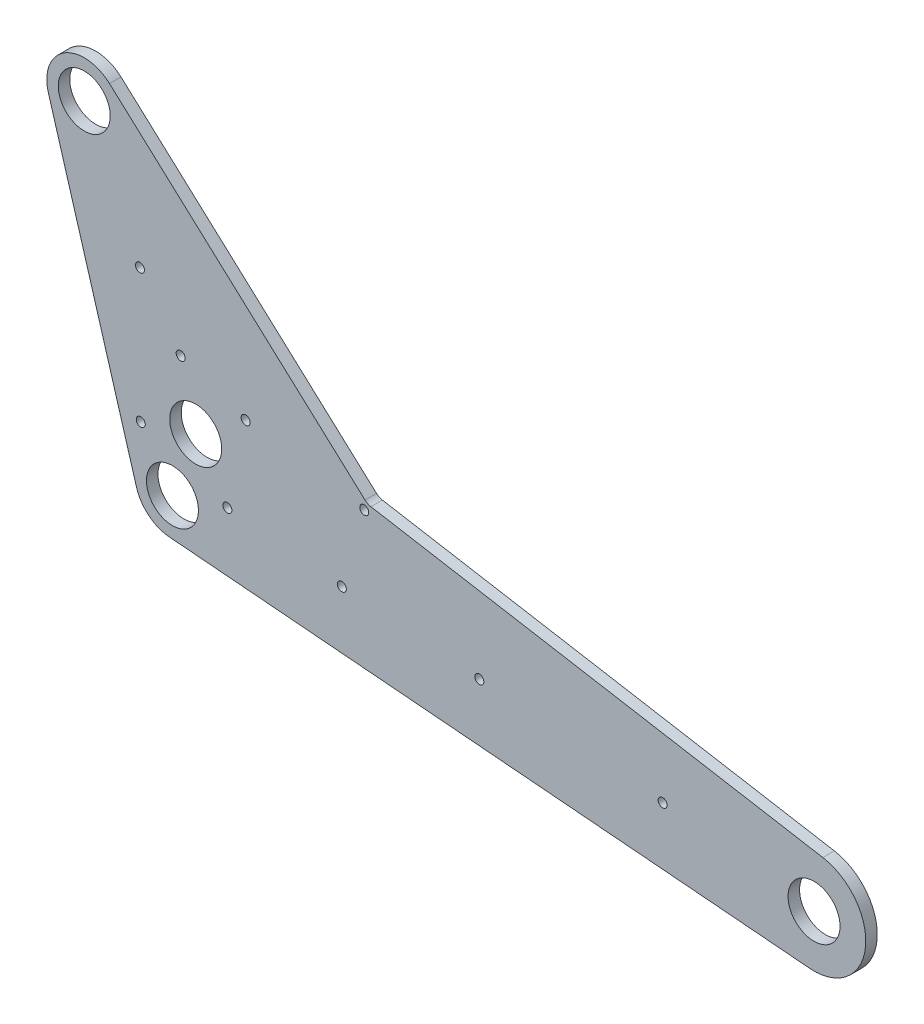
ISO-10303-21;
HEADER;
FILE_DESCRIPTION(('STEP AP214'),'2;1');
FILE_NAME('part.step','',(''),(''),'','','');
FILE_SCHEMA(('AUTOMOTIVE_DESIGN { 1 0 10303 214 1 1 1 1 }'));
ENDSEC;
DATA;
#1=APPLICATION_CONTEXT('core data for automotive mechanical design processes');
#2=APPLICATION_PROTOCOL_DEFINITION('international standard','automotive_design',2000,#1);
#3=PRODUCT_CONTEXT('',#1,'mechanical');
#4=PRODUCT('Part','Part','',(#3));
#5=PRODUCT_RELATED_PRODUCT_CATEGORY('part','',(#4));
#6=PRODUCT_DEFINITION_FORMATION('','',#4);
#7=PRODUCT_DEFINITION_CONTEXT('part definition',#1,'design');
#8=PRODUCT_DEFINITION('design','',#6,#7);
#9=PRODUCT_DEFINITION_SHAPE('','',#8);
#10=(LENGTH_UNIT() NAMED_UNIT(*) SI_UNIT(.MILLI.,.METRE.));
#11=(NAMED_UNIT(*) PLANE_ANGLE_UNIT() SI_UNIT($,.RADIAN.));
#12=(NAMED_UNIT(*) SI_UNIT($,.STERADIAN.) SOLID_ANGLE_UNIT());
#13=UNCERTAINTY_MEASURE_WITH_UNIT(LENGTH_MEASURE(1.E-05),#10,'distance_accuracy_value','');
#14=(GEOMETRIC_REPRESENTATION_CONTEXT(3) GLOBAL_UNCERTAINTY_ASSIGNED_CONTEXT((#13)) GLOBAL_UNIT_ASSIGNED_CONTEXT((#10,
#11,#12)) REPRESENTATION_CONTEXT('',''));
#15=CARTESIAN_POINT('',(0.,0.,0.));
#16=DIRECTION('',(0.,0.,1.));
#17=DIRECTION('',(1.,0.,0.));
#18=AXIS2_PLACEMENT_3D('',#15,#16,#17);
#19=CARTESIAN_POINT('',(0.,0.,3.175));
#20=DIRECTION('',(0.,0.,1.));
#21=DIRECTION('',(1.,0.,0.));
#22=AXIS2_PLACEMENT_3D('',#19,#20,#21);
#23=PLANE('',#22);
#24=CARTESIAN_POINT('',(-372.26106716212,121.779539966283,3.175));
#25=DIRECTION('',(0.,0.,1.));
#26=DIRECTION('',(1.,0.,0.));
#27=AXIS2_PLACEMENT_3D('',#24,#25,#26);
#28=CIRCLE('',#27,2.48920000000001);
#29=CARTESIAN_POINT('',(-369.77186716212,121.779539966283,3.175));
#30=VERTEX_POINT('',#29);
#31=EDGE_CURVE('E227',#30,#30,#28,.T.);
#32=ORIENTED_EDGE('',*,*,#31,.F.);
#33=EDGE_LOOP('',(#32));
#34=FACE_BOUND('',#33,.T.);
#35=CARTESIAN_POINT('',(-83.6094294253475,10.1591935134989,3.175));
#36=DIRECTION('',(0.,0.,1.));
#37=DIRECTION('',(1.,0.,0.));
#38=AXIS2_PLACEMENT_3D('',#35,#36,#37);
#39=CIRCLE('',#38,2.4892);
#40=CARTESIAN_POINT('',(-81.1202294253475,10.1591935134989,3.175));
#41=VERTEX_POINT('',#40);
#42=EDGE_CURVE('E231',#41,#41,#39,.T.);
#43=ORIENTED_EDGE('',*,*,#42,.F.);
#44=EDGE_LOOP('',(#43));
#45=FACE_BOUND('',#44,.T.);
#46=CARTESIAN_POINT('',(-260.794262036313,24.9367133535894,3.175));
#47=DIRECTION('',(0.,0.,1.));
#48=DIRECTION('',(1.,0.,0.));
#49=AXIS2_PLACEMENT_3D('',#46,#47,#48);
#50=CIRCLE('',#49,2.48920000000001);
#51=CARTESIAN_POINT('',(-258.305062036313,24.9367133535894,3.175));
#52=VERTEX_POINT('',#51);
#53=EDGE_CURVE('E224',#52,#52,#50,.T.);
#54=ORIENTED_EDGE('',*,*,#53,.F.);
#55=EDGE_LOOP('',(#54));
#56=FACE_BOUND('',#55,.T.);
#57=CARTESIAN_POINT('',(-184.857905203042,18.6034905649792,3.175));
#58=DIRECTION('',(0.,0.,1.));
#59=DIRECTION('',(1.,0.,0.));
#60=AXIS2_PLACEMENT_3D('',#57,#58,#59);
#61=CIRCLE('',#60,2.4892);
#62=CARTESIAN_POINT('',(-182.368705203042,18.6034905649792,3.175));
#63=VERTEX_POINT('',#62);
#64=EDGE_CURVE('E223',#63,#63,#61,.T.);
#65=ORIENTED_EDGE('',*,*,#64,.F.);
#66=EDGE_LOOP('',(#65));
#67=FACE_BOUND('',#66,.T.);
#68=CARTESIAN_POINT('',(-313.915715632056,77.9926583420795,3.175));
#69=DIRECTION('',(0.,0.,1.));
#70=DIRECTION('',(1.,0.,0.));
#71=AXIS2_PLACEMENT_3D('',#68,#69,#70);
#72=CIRCLE('',#71,2.48920000000001);
#73=CARTESIAN_POINT('',(-311.426515632056,77.9926583420795,3.175));
#74=VERTEX_POINT('',#73);
#75=EDGE_CURVE('E199',#74,#74,#72,.T.);
#76=ORIENTED_EDGE('',*,*,#75,.F.);
#77=EDGE_LOOP('',(#76));
#78=FACE_BOUND('',#77,.T.);
#79=CARTESIAN_POINT('',(-349.782746383436,90.8443549257835,3.175));
#80=DIRECTION('',(0.,0.,1.));
#81=DIRECTION('',(1.,0.,0.));
#82=AXIS2_PLACEMENT_3D('',#79,#80,#81);
#83=CIRCLE('',#82,2.48920000000001);
#84=CARTESIAN_POINT('',(-347.293546383436,90.8443549257835,3.175));
#85=VERTEX_POINT('',#84);
#86=EDGE_CURVE('E206',#85,#85,#83,.T.);
#87=ORIENTED_EDGE('',*,*,#86,.F.);
#88=EDGE_LOOP('',(#87));
#89=FACE_BOUND('',#88,.T.);
#90=CARTESIAN_POINT('',(-371.825205571629,48.1525159171764,3.175));
#91=DIRECTION('',(0.,0.,1.));
#92=DIRECTION('',(1.,0.,0.));
#93=AXIS2_PLACEMENT_3D('',#90,#91,#92);
#94=CIRCLE('',#93,2.48919999999983);
#95=CARTESIAN_POINT('',(-369.336005571629,48.1525159171764,3.175));
#96=VERTEX_POINT('',#95);
#97=EDGE_CURVE('E212',#96,#96,#94,.T.);
#98=ORIENTED_EDGE('',*,*,#97,.F.);
#99=EDGE_LOOP('',(#98));
#100=FACE_BOUND('',#99,.T.);
#101=CARTESIAN_POINT('',(-324.002497903123,31.0169204722377,3.175));
#102=DIRECTION('',(0.,0.,1.));
#103=DIRECTION('',(1.,0.,0.));
#104=AXIS2_PLACEMENT_3D('',#101,#102,#103);
#105=CIRCLE('',#104,2.48920000000001);
#106=CARTESIAN_POINT('',(-321.513297903123,31.0169204722377,3.175));
#107=VERTEX_POINT('',#106);
#108=EDGE_CURVE('E193',#107,#107,#105,.T.);
#109=ORIENTED_EDGE('',*,*,#108,.F.);
#110=EDGE_LOOP('',(#109));
#111=FACE_BOUND('',#110,.T.);
#112=CARTESIAN_POINT('',(-341.488003445524,57.5182335703968,3.175));
#113=DIRECTION('',(0.,0.,1.));
#114=DIRECTION('',(1.,0.,0.));
#115=AXIS2_PLACEMENT_3D('',#112,#113,#114);
#116=CIRCLE('',#115,14.3510000000001);
#117=CARTESIAN_POINT('',(-327.137003445524,57.5182335703968,3.175));
#118=VERTEX_POINT('',#117);
#119=EDGE_CURVE('E190',#118,#118,#116,.T.);
#120=ORIENTED_EDGE('',*,*,#119,.F.);
#121=EDGE_LOOP('',(#120));
#122=FACE_BOUND('',#121,.T.);
#123=CARTESIAN_POINT('',(-403.034130878715,186.040846362169,3.175));
#124=DIRECTION('',(0.,0.,1.));
#125=DIRECTION('',(1.,0.,0.));
#126=AXIS2_PLACEMENT_3D('',#123,#124,#125);
#127=CIRCLE('',#126,14.3510000000001);
#128=CARTESIAN_POINT('',(-388.683130878715,186.040846362169,3.175));
#129=VERTEX_POINT('',#128);
#130=EDGE_CURVE('E175',#129,#129,#127,.T.);
#131=ORIENTED_EDGE('',*,*,#130,.F.);
#132=EDGE_LOOP('',(#131));
#133=FACE_BOUND('',#132,.T.);
#134=CARTESIAN_POINT('',(-248.402370748276,67.7567016355575,3.175));
#135=DIRECTION('',(0.,0.,1.));
#136=DIRECTION('',(1.,0.,0.));
#137=AXIS2_PLACEMENT_3D('',#134,#135,#136);
#138=CIRCLE('',#137,2.48920000000006);
#139=CARTESIAN_POINT('',(-245.913170748276,67.7567016355575,3.175));
#140=VERTEX_POINT('',#139);
#141=EDGE_CURVE('E157',#140,#140,#138,.T.);
#142=ORIENTED_EDGE('',*,*,#141,.F.);
#143=EDGE_LOOP('',(#142));
#144=FACE_BOUND('',#143,.T.);
#145=CARTESIAN_POINT('',(0.,0.,3.175));
#146=DIRECTION('',(0.,0.,1.));
#147=DIRECTION('',(1.,0.,0.));
#148=AXIS2_PLACEMENT_3D('',#145,#146,#147);
#149=CIRCLE('',#148,28.575);
#150=CARTESIAN_POINT('',(-2.37495854572882,-28.4761338124765,3.175));
#151=VERTEX_POINT('',#150);
#152=CARTESIAN_POINT('',(4.84999720772335,28.1604004248,3.175));
#153=VERTEX_POINT('',#152);
#154=EDGE_CURVE('E111',#151,#153,#149,.T.);
#155=ORIENTED_EDGE('',*,*,#154,.T.);
#156=DIRECTION('',(-0.985490828514435,0.169728686184544,0.));
#157=VECTOR('',#156,1.);
#158=CARTESIAN_POINT('',(4.84999720772335,28.1604004248,3.175));
#159=LINE('',#158,#157);
#160=CARTESIAN_POINT('',(-244.760530249024,71.1502138834691,3.175));
#161=VERTEX_POINT('',#160);
#162=EDGE_CURVE('E102',#153,#161,#159,.T.);
#163=ORIENTED_EDGE('',*,*,#162,.T.);
#164=CARTESIAN_POINT('',(-243.682753091752,77.4080806445357,3.175));
#165=DIRECTION('',(0.,0.,1.));
#166=DIRECTION('',(1.,0.,0.));
#167=AXIS2_PLACEMENT_3D('',#164,#165,#166);
#168=CIRCLE('',#167,6.35);
#169=CARTESIAN_POINT('',(-247.96016138867,72.7148644486363,3.175));
#170=VERTEX_POINT('',#169);
#171=EDGE_CURVE('E11',#161,#170,#168,.F.);
#172=ORIENTED_EDGE('',*,*,#171,.T.);
#173=DIRECTION('',(-0.739089164708576,0.673607605813933,0.));
#174=VECTOR('',#173,1.);
#175=CARTESIAN_POINT('',(-389.089779830761,201.340731160801,3.175));
#176=LINE('',#175,#174);
#177=CARTESIAN_POINT('',(-389.089779830761,201.340731160801,3.175));
#178=VERTEX_POINT('',#177);
#179=EDGE_CURVE('E110',#170,#178,#176,.T.);
#180=ORIENTED_EDGE('',*,*,#179,.T.);
#181=CARTESIAN_POINT('',(-403.034130878715,186.040846362169,3.175));
#182=DIRECTION('',(0.,0.,1.));
#183=DIRECTION('',(1.,0.,0.));
#184=AXIS2_PLACEMENT_3D('',#181,#182,#183);
#185=CIRCLE('',#184,20.701);
#186=CARTESIAN_POINT('',(-422.882658210222,180.161444711453,3.175));
#187=VERTEX_POINT('',#186);
#188=EDGE_CURVE('E163',#178,#187,#185,.T.);
#189=ORIENTED_EDGE('',*,*,#188,.T.);
#190=DIRECTION('',(0.28401534470392,-0.958819734868194,0.));
#191=VECTOR('',#190,1.);
#192=CARTESIAN_POINT('',(-374.188227360735,15.7718011683014,3.175));
#193=LINE('',#192,#191);
#194=CARTESIAN_POINT('',(-374.188227360735,15.7718011683014,3.175));
#195=VERTEX_POINT('',#194);
#196=EDGE_CURVE('E161',#187,#195,#193,.T.);
#197=ORIENTED_EDGE('',*,*,#196,.T.);
#198=CARTESIAN_POINT('',(-354.339700029228,21.6512028190172,3.175));
#199=DIRECTION('',(0.,0.,1.));
#200=DIRECTION('',(1.,0.,0.));
#201=AXIS2_PLACEMENT_3D('',#198,#199,#200);
#202=CIRCLE('',#201,20.701);
#203=CARTESIAN_POINT('',(-356.060225553467,1.02182587931198,3.175));
#204=VERTEX_POINT('',#203);
#205=EDGE_CURVE('E159',#195,#204,#202,.T.);
#206=ORIENTED_EDGE('',*,*,#205,.T.);
#207=DIRECTION('',(0.996540115922189,-0.0831131599555144,0.));
#208=VECTOR('',#207,1.);
#209=CARTESIAN_POINT('',(-356.060225553467,1.02182587931198,3.175));
#210=LINE('',#209,#208);
#211=EDGE_CURVE('E116',#204,#151,#210,.T.);
#212=ORIENTED_EDGE('',*,*,#211,.T.);
#213=EDGE_LOOP('',(#155,#163,#172,#180,#189,#197,#206,#212));
#214=FACE_BOUND('',#213,.T.);
#215=CARTESIAN_POINT('',(0.,0.,3.175));
#216=DIRECTION('',(0.,0.,1.));
#217=DIRECTION('',(1.,0.,0.));
#218=AXIS2_PLACEMENT_3D('',#215,#216,#217);
#219=CIRCLE('',#218,14.351);
#220=CARTESIAN_POINT('',(14.351,0.,3.175));
#221=VERTEX_POINT('',#220);
#222=EDGE_CURVE('E169',#221,#221,#219,.T.);
#223=ORIENTED_EDGE('',*,*,#222,.F.);
#224=EDGE_LOOP('',(#223));
#225=FACE_BOUND('',#224,.T.);
#226=CARTESIAN_POINT('',(-354.339700029228,21.6512028190172,3.175));
#227=DIRECTION('',(0.,0.,1.));
#228=DIRECTION('',(1.,0.,0.));
#229=AXIS2_PLACEMENT_3D('',#226,#227,#228);
#230=CIRCLE('',#229,14.3510000000001);
#231=CARTESIAN_POINT('',(-339.988700029228,21.6512028190172,3.175));
#232=VERTEX_POINT('',#231);
#233=EDGE_CURVE('E181',#232,#232,#230,.T.);
#234=ORIENTED_EDGE('',*,*,#233,.F.);
#235=EDGE_LOOP('',(#234));
#236=FACE_BOUND('',#235,.T.);
#237=ADVANCED_FACE('F41',(#34,#45,#56,#67,#78,#89,#100,#111,#122,#133,#144,#214,#225,#236),#23,.T.);
#238=CARTESIAN_POINT('',(0.,0.,-3.175));
#239=DIRECTION('',(0.,0.,1.));
#240=DIRECTION('',(1.,0.,0.));
#241=AXIS2_PLACEMENT_3D('',#238,#239,#240);
#242=PLANE('',#241);
#243=CARTESIAN_POINT('',(-372.26106716212,121.779539966283,-3.175));
#244=DIRECTION('',(0.,0.,1.));
#245=DIRECTION('',(1.,0.,0.));
#246=AXIS2_PLACEMENT_3D('',#243,#244,#245);
#247=CIRCLE('',#246,2.48920000000001);
#248=CARTESIAN_POINT('',(-369.77186716212,121.779539966283,-3.175));
#249=VERTEX_POINT('',#248);
#250=EDGE_CURVE('E200',#249,#249,#247,.T.);
#251=ORIENTED_EDGE('',*,*,#250,.T.);
#252=EDGE_LOOP('',(#251));
#253=FACE_BOUND('',#252,.T.);
#254=CARTESIAN_POINT('',(-83.6094294253475,10.1591935134989,-3.175));
#255=DIRECTION('',(0.,0.,1.));
#256=DIRECTION('',(1.,0.,0.));
#257=AXIS2_PLACEMENT_3D('',#254,#255,#256);
#258=CIRCLE('',#257,2.4892);
#259=CARTESIAN_POINT('',(-81.1202294253475,10.1591935134989,-3.175));
#260=VERTEX_POINT('',#259);
#261=EDGE_CURVE('E228',#260,#260,#258,.T.);
#262=ORIENTED_EDGE('',*,*,#261,.T.);
#263=EDGE_LOOP('',(#262));
#264=FACE_BOUND('',#263,.T.);
#265=CARTESIAN_POINT('',(-260.794262036313,24.9367133535894,-3.175));
#266=DIRECTION('',(0.,0.,1.));
#267=DIRECTION('',(1.,0.,0.));
#268=AXIS2_PLACEMENT_3D('',#265,#266,#267);
#269=CIRCLE('',#268,2.48920000000001);
#270=CARTESIAN_POINT('',(-258.305062036313,24.9367133535894,-3.175));
#271=VERTEX_POINT('',#270);
#272=EDGE_CURVE('E234',#271,#271,#269,.T.);
#273=ORIENTED_EDGE('',*,*,#272,.T.);
#274=EDGE_LOOP('',(#273));
#275=FACE_BOUND('',#274,.T.);
#276=CARTESIAN_POINT('',(-184.857905203042,18.6034905649792,-3.175));
#277=DIRECTION('',(0.,0.,1.));
#278=DIRECTION('',(1.,0.,0.));
#279=AXIS2_PLACEMENT_3D('',#276,#277,#278);
#280=CIRCLE('',#279,2.4892);
#281=CARTESIAN_POINT('',(-182.368705203042,18.6034905649792,-3.175));
#282=VERTEX_POINT('',#281);
#283=EDGE_CURVE('E220',#282,#282,#280,.T.);
#284=ORIENTED_EDGE('',*,*,#283,.T.);
#285=EDGE_LOOP('',(#284));
#286=FACE_BOUND('',#285,.T.);
#287=CARTESIAN_POINT('',(-313.915715632056,77.9926583420795,-3.175));
#288=DIRECTION('',(0.,0.,1.));
#289=DIRECTION('',(1.,0.,0.));
#290=AXIS2_PLACEMENT_3D('',#287,#288,#289);
#291=CIRCLE('',#290,2.48920000000001);
#292=CARTESIAN_POINT('',(-311.426515632056,77.9926583420795,-3.175));
#293=VERTEX_POINT('',#292);
#294=EDGE_CURVE('E196',#293,#293,#291,.T.);
#295=ORIENTED_EDGE('',*,*,#294,.T.);
#296=EDGE_LOOP('',(#295));
#297=FACE_BOUND('',#296,.T.);
#298=CARTESIAN_POINT('',(-349.782746383436,90.8443549257835,-3.175));
#299=DIRECTION('',(0.,0.,1.));
#300=DIRECTION('',(1.,0.,0.));
#301=AXIS2_PLACEMENT_3D('',#298,#299,#300);
#302=CIRCLE('',#301,2.48920000000001);
#303=CARTESIAN_POINT('',(-347.293546383436,90.8443549257835,-3.175));
#304=VERTEX_POINT('',#303);
#305=EDGE_CURVE('E203',#304,#304,#302,.T.);
#306=ORIENTED_EDGE('',*,*,#305,.T.);
#307=EDGE_LOOP('',(#306));
#308=FACE_BOUND('',#307,.T.);
#309=CARTESIAN_POINT('',(-371.825205571629,48.1525159171764,-3.175));
#310=DIRECTION('',(0.,0.,1.));
#311=DIRECTION('',(1.,0.,0.));
#312=AXIS2_PLACEMENT_3D('',#309,#310,#311);
#313=CIRCLE('',#312,2.48919999999983);
#314=CARTESIAN_POINT('',(-369.336005571629,48.1525159171764,-3.175));
#315=VERTEX_POINT('',#314);
#316=EDGE_CURVE('E209',#315,#315,#313,.T.);
#317=ORIENTED_EDGE('',*,*,#316,.T.);
#318=EDGE_LOOP('',(#317));
#319=FACE_BOUND('',#318,.T.);
#320=CARTESIAN_POINT('',(-324.002497903123,31.0169204722377,-3.175));
#321=DIRECTION('',(0.,0.,1.));
#322=DIRECTION('',(1.,0.,0.));
#323=AXIS2_PLACEMENT_3D('',#320,#321,#322);
#324=CIRCLE('',#323,2.48920000000001);
#325=CARTESIAN_POINT('',(-321.513297903123,31.0169204722377,-3.175));
#326=VERTEX_POINT('',#325);
#327=EDGE_CURVE('E215',#326,#326,#324,.T.);
#328=ORIENTED_EDGE('',*,*,#327,.T.);
#329=EDGE_LOOP('',(#328));
#330=FACE_BOUND('',#329,.T.);
#331=CARTESIAN_POINT('',(-341.488003445524,57.5182335703968,-3.175));
#332=DIRECTION('',(0.,0.,1.));
#333=DIRECTION('',(1.,0.,0.));
#334=AXIS2_PLACEMENT_3D('',#331,#332,#333);
#335=CIRCLE('',#334,14.3510000000001);
#336=CARTESIAN_POINT('',(-327.137003445524,57.5182335703968,-3.175));
#337=VERTEX_POINT('',#336);
#338=EDGE_CURVE('E187',#337,#337,#335,.T.);
#339=ORIENTED_EDGE('',*,*,#338,.T.);
#340=EDGE_LOOP('',(#339));
#341=FACE_BOUND('',#340,.T.);
#342=CARTESIAN_POINT('',(0.,0.,-3.175));
#343=DIRECTION('',(0.,0.,1.));
#344=DIRECTION('',(1.,0.,0.));
#345=AXIS2_PLACEMENT_3D('',#342,#343,#344);
#346=CIRCLE('',#345,28.575);
#347=CARTESIAN_POINT('',(-2.37495854572882,-28.4761338124765,-3.175));
#348=VERTEX_POINT('',#347);
#349=CARTESIAN_POINT('',(4.84999720772335,28.1604004248,-3.175));
#350=VERTEX_POINT('',#349);
#351=EDGE_CURVE('E124',#348,#350,#346,.T.);
#352=ORIENTED_EDGE('',*,*,#351,.F.);
#353=DIRECTION('',(0.996540115922189,-0.0831131599555144,0.));
#354=VECTOR('',#353,1.);
#355=CARTESIAN_POINT('',(-356.060225553467,1.02182587931198,-3.175));
#356=LINE('',#355,#354);
#357=CARTESIAN_POINT('',(-356.060225553467,1.02182587931198,-3.175));
#358=VERTEX_POINT('',#357);
#359=EDGE_CURVE('E120',#358,#348,#356,.T.);
#360=ORIENTED_EDGE('',*,*,#359,.F.);
#361=CARTESIAN_POINT('',(-354.339700029228,21.6512028190172,-3.175));
#362=DIRECTION('',(0.,0.,1.));
#363=DIRECTION('',(1.,0.,0.));
#364=AXIS2_PLACEMENT_3D('',#361,#362,#363);
#365=CIRCLE('',#364,20.701);
#366=CARTESIAN_POINT('',(-374.188227360735,15.7718011683014,-3.175));
#367=VERTEX_POINT('',#366);
#368=EDGE_CURVE('E146',#367,#358,#365,.T.);
#369=ORIENTED_EDGE('',*,*,#368,.F.);
#370=DIRECTION('',(0.28401534470392,-0.958819734868194,0.));
#371=VECTOR('',#370,1.);
#372=CARTESIAN_POINT('',(-374.188227360735,15.7718011683014,-3.175));
#373=LINE('',#372,#371);
#374=CARTESIAN_POINT('',(-422.882658210222,180.161444711453,-3.175));
#375=VERTEX_POINT('',#374);
#376=EDGE_CURVE('E148',#375,#367,#373,.T.);
#377=ORIENTED_EDGE('',*,*,#376,.F.);
#378=CARTESIAN_POINT('',(-403.034130878715,186.040846362169,-3.175));
#379=DIRECTION('',(0.,0.,1.));
#380=DIRECTION('',(1.,0.,0.));
#381=AXIS2_PLACEMENT_3D('',#378,#379,#380);
#382=CIRCLE('',#381,20.701);
#383=CARTESIAN_POINT('',(-389.089779830761,201.340731160801,-3.175));
#384=VERTEX_POINT('',#383);
#385=EDGE_CURVE('E150',#384,#375,#382,.T.);
#386=ORIENTED_EDGE('',*,*,#385,.F.);
#387=DIRECTION('',(-0.739089164708576,0.673607605813933,0.));
#388=VECTOR('',#387,1.);
#389=CARTESIAN_POINT('',(-389.089779830761,201.340731160801,-3.175));
#390=LINE('',#389,#388);
#391=CARTESIAN_POINT('',(-247.96016138867,72.7148644486363,-3.175));
#392=VERTEX_POINT('',#391);
#393=EDGE_CURVE('E152',#392,#384,#390,.T.);
#394=ORIENTED_EDGE('',*,*,#393,.F.);
#395=CARTESIAN_POINT('',(-243.682753091752,77.4080806445357,-3.175));
#396=DIRECTION('',(0.,0.,1.));
#397=DIRECTION('',(1.,0.,0.));
#398=AXIS2_PLACEMENT_3D('',#395,#396,#397);
#399=CIRCLE('',#398,6.35);
#400=CARTESIAN_POINT('',(-244.760530249024,71.1502138834691,-3.175));
#401=VERTEX_POINT('',#400);
#402=EDGE_CURVE('E49',#392,#401,#399,.T.);
#403=ORIENTED_EDGE('',*,*,#402,.T.);
#404=DIRECTION('',(-0.985490828514435,0.169728686184544,0.));
#405=VECTOR('',#404,1.);
#406=CARTESIAN_POINT('',(4.84999720772335,28.1604004248,-3.175));
#407=LINE('',#406,#405);
#408=EDGE_CURVE('E154',#350,#401,#407,.T.);
#409=ORIENTED_EDGE('',*,*,#408,.F.);
#410=EDGE_LOOP('',(#352,#360,#369,#377,#386,#394,#403,#409));
#411=FACE_BOUND('',#410,.T.);
#412=CARTESIAN_POINT('',(-248.402370748276,67.7567016355575,-3.175));
#413=DIRECTION('',(0.,0.,1.));
#414=DIRECTION('',(1.,0.,0.));
#415=AXIS2_PLACEMENT_3D('',#412,#413,#414);
#416=CIRCLE('',#415,2.48920000000006);
#417=CARTESIAN_POINT('',(-245.913170748276,67.7567016355575,-3.175));
#418=VERTEX_POINT('',#417);
#419=EDGE_CURVE('E166',#418,#418,#416,.T.);
#420=ORIENTED_EDGE('',*,*,#419,.T.);
#421=EDGE_LOOP('',(#420));
#422=FACE_BOUND('',#421,.T.);
#423=CARTESIAN_POINT('',(0.,0.,-3.175));
#424=DIRECTION('',(0.,0.,1.));
#425=DIRECTION('',(1.,0.,0.));
#426=AXIS2_PLACEMENT_3D('',#423,#424,#425);
#427=CIRCLE('',#426,14.351);
#428=CARTESIAN_POINT('',(14.351,0.,-3.175));
#429=VERTEX_POINT('',#428);
#430=EDGE_CURVE('E172',#429,#429,#427,.T.);
#431=ORIENTED_EDGE('',*,*,#430,.T.);
#432=EDGE_LOOP('',(#431));
#433=FACE_BOUND('',#432,.T.);
#434=CARTESIAN_POINT('',(-403.034130878715,186.040846362169,-3.175));
#435=DIRECTION('',(0.,0.,1.));
#436=DIRECTION('',(1.,0.,0.));
#437=AXIS2_PLACEMENT_3D('',#434,#435,#436);
#438=CIRCLE('',#437,14.3510000000001);
#439=CARTESIAN_POINT('',(-388.683130878715,186.040846362169,-3.175));
#440=VERTEX_POINT('',#439);
#441=EDGE_CURVE('E178',#440,#440,#438,.T.);
#442=ORIENTED_EDGE('',*,*,#441,.T.);
#443=EDGE_LOOP('',(#442));
#444=FACE_BOUND('',#443,.T.);
#445=CARTESIAN_POINT('',(-354.339700029228,21.6512028190172,-3.175));
#446=DIRECTION('',(0.,0.,1.));
#447=DIRECTION('',(1.,0.,0.));
#448=AXIS2_PLACEMENT_3D('',#445,#446,#447);
#449=CIRCLE('',#448,14.3510000000001);
#450=CARTESIAN_POINT('',(-339.988700029228,21.6512028190172,-3.175));
#451=VERTEX_POINT('',#450);
#452=EDGE_CURVE('E184',#451,#451,#449,.T.);
#453=ORIENTED_EDGE('',*,*,#452,.T.);
#454=EDGE_LOOP('',(#453));
#455=FACE_BOUND('',#454,.T.);
#456=ADVANCED_FACE('F244',(#253,#264,#275,#286,#297,#308,#319,#330,#341,#411,#422,#433,#444,
#455),#242,.F.);
#457=CARTESIAN_POINT('',(0.,0.,3.175));
#458=DIRECTION('',(0.,0.,-1.));
#459=DIRECTION('',(-1.,0.,0.));
#460=AXIS2_PLACEMENT_3D('',#457,#458,#459);
#461=CYLINDRICAL_SURFACE('',#460,28.575);
#462=ORIENTED_EDGE('',*,*,#351,.T.);
#463=DIRECTION('',(0.,0.,-1.));
#464=VECTOR('',#463,1.);
#465=CARTESIAN_POINT('',(4.84999720772335,28.1604004248,3.175));
#466=LINE('',#465,#464);
#467=EDGE_CURVE('E106',#153,#350,#466,.T.);
#468=ORIENTED_EDGE('',*,*,#467,.F.);
#469=ORIENTED_EDGE('',*,*,#154,.F.);
#470=DIRECTION('',(0.,0.,-1.));
#471=VECTOR('',#470,1.);
#472=CARTESIAN_POINT('',(-2.37495854572882,-28.4761338124765,3.175));
#473=LINE('',#472,#471);
#474=EDGE_CURVE('E143',#151,#348,#473,.T.);
#475=ORIENTED_EDGE('',*,*,#474,.T.);
#476=EDGE_LOOP('',(#462,#468,#469,#475));
#477=FACE_BOUND('',#476,.T.);
#478=ADVANCED_FACE('F122',(#477),#461,.T.);
#479=CARTESIAN_POINT('',(4.84999720772335,28.1604004248,3.175));
#480=DIRECTION('',(-0.169728686184545,-0.985490828514436,0.));
#481=DIRECTION('',(0.985490828514436,-0.169728686184545,0.));
#482=AXIS2_PLACEMENT_3D('',#479,#480,#481);
#483=PLANE('',#482);
#484=ORIENTED_EDGE('',*,*,#408,.T.);
#485=DIRECTION('',(0.,0.,-1.));
#486=VECTOR('',#485,1.);
#487=CARTESIAN_POINT('',(-244.760530249024,71.1502138834691,3.175));
#488=LINE('',#487,#486);
#489=EDGE_CURVE('E56',#401,#161,#488,.F.);
#490=ORIENTED_EDGE('',*,*,#489,.T.);
#491=ORIENTED_EDGE('',*,*,#162,.F.);
#492=ORIENTED_EDGE('',*,*,#467,.T.);
#493=EDGE_LOOP('',(#484,#490,#491,#492));
#494=FACE_BOUND('',#493,.T.);
#495=ADVANCED_FACE('F104',(#494),#483,.F.);
#496=CARTESIAN_POINT('',(-389.089779830761,201.340731160801,3.175));
#497=DIRECTION('',(-0.673607605813933,-0.739089164708576,0.));
#498=DIRECTION('',(0.739089164708576,-0.673607605813933,0.));
#499=AXIS2_PLACEMENT_3D('',#496,#497,#498);
#500=PLANE('',#499);
#501=ORIENTED_EDGE('',*,*,#179,.F.);
#502=DIRECTION('',(0.,0.,-1.));
#503=VECTOR('',#502,1.);
#504=CARTESIAN_POINT('',(-247.96016138867,72.7148644486363,-3.175));
#505=LINE('',#504,#503);
#506=EDGE_CURVE('E125',#170,#392,#505,.T.);
#507=ORIENTED_EDGE('',*,*,#506,.T.);
#508=ORIENTED_EDGE('',*,*,#393,.T.);
#509=DIRECTION('',(0.,0.,-1.));
#510=VECTOR('',#509,1.);
#511=CARTESIAN_POINT('',(-389.089779830761,201.340731160801,3.175));
#512=LINE('',#511,#510);
#513=EDGE_CURVE('E126',#178,#384,#512,.T.);
#514=ORIENTED_EDGE('',*,*,#513,.F.);
#515=EDGE_LOOP('',(#501,#507,#508,#514));
#516=FACE_BOUND('',#515,.T.);
#517=ADVANCED_FACE('F328',(#516),#500,.F.);
#518=CARTESIAN_POINT('',(-403.034130878715,186.040846362169,3.175));
#519=DIRECTION('',(0.,0.,-1.));
#520=DIRECTION('',(-1.,0.,0.));
#521=AXIS2_PLACEMENT_3D('',#518,#519,#520);
#522=CYLINDRICAL_SURFACE('',#521,20.701);
#523=ORIENTED_EDGE('',*,*,#385,.T.);
#524=DIRECTION('',(0.,0.,-1.));
#525=VECTOR('',#524,1.);
#526=CARTESIAN_POINT('',(-422.882658210222,180.161444711453,3.175));
#527=LINE('',#526,#525);
#528=EDGE_CURVE('E131',#187,#375,#527,.T.);
#529=ORIENTED_EDGE('',*,*,#528,.F.);
#530=ORIENTED_EDGE('',*,*,#188,.F.);
#531=ORIENTED_EDGE('',*,*,#513,.T.);
#532=EDGE_LOOP('',(#523,#529,#530,#531));
#533=FACE_BOUND('',#532,.T.);
#534=ADVANCED_FACE('F324',(#533),#522,.T.);
#535=CARTESIAN_POINT('',(-374.188227360735,15.7718011683014,3.175));
#536=DIRECTION('',(0.958819734868194,0.28401534470392,0.));
#537=DIRECTION('',(-0.28401534470392,0.958819734868194,0.));
#538=AXIS2_PLACEMENT_3D('',#535,#536,#537);
#539=PLANE('',#538);
#540=ORIENTED_EDGE('',*,*,#376,.T.);
#541=DIRECTION('',(0.,0.,-1.));
#542=VECTOR('',#541,1.);
#543=CARTESIAN_POINT('',(-374.188227360735,15.7718011683014,3.175));
#544=LINE('',#543,#542);
#545=EDGE_CURVE('E137',#195,#367,#544,.T.);
#546=ORIENTED_EDGE('',*,*,#545,.F.);
#547=ORIENTED_EDGE('',*,*,#196,.F.);
#548=ORIENTED_EDGE('',*,*,#528,.T.);
#549=EDGE_LOOP('',(#540,#546,#547,#548));
#550=FACE_BOUND('',#549,.T.);
#551=ADVANCED_FACE('F320',(#550),#539,.F.);
#552=CARTESIAN_POINT('',(-354.339700029228,21.6512028190172,3.175));
#553=DIRECTION('',(0.,0.,-1.));
#554=DIRECTION('',(-1.,0.,0.));
#555=AXIS2_PLACEMENT_3D('',#552,#553,#554);
#556=CYLINDRICAL_SURFACE('',#555,20.701);
#557=ORIENTED_EDGE('',*,*,#368,.T.);
#558=DIRECTION('',(0.,0.,-1.));
#559=VECTOR('',#558,1.);
#560=CARTESIAN_POINT('',(-356.060225553467,1.02182587931198,3.175));
#561=LINE('',#560,#559);
#562=EDGE_CURVE('E140',#204,#358,#561,.T.);
#563=ORIENTED_EDGE('',*,*,#562,.F.);
#564=ORIENTED_EDGE('',*,*,#205,.F.);
#565=ORIENTED_EDGE('',*,*,#545,.T.);
#566=EDGE_LOOP('',(#557,#563,#564,#565));
#567=FACE_BOUND('',#566,.T.);
#568=ADVANCED_FACE('F316',(#567),#556,.T.);
#569=CARTESIAN_POINT('',(-356.060225553467,1.02182587931198,3.175));
#570=DIRECTION('',(0.0831131599555144,0.996540115922188,0.));
#571=DIRECTION('',(-0.996540115922189,0.0831131599555144,0.));
#572=AXIS2_PLACEMENT_3D('',#569,#570,#571);
#573=PLANE('',#572);
#574=ORIENTED_EDGE('',*,*,#359,.T.);
#575=ORIENTED_EDGE('',*,*,#474,.F.);
#576=ORIENTED_EDGE('',*,*,#211,.F.);
#577=ORIENTED_EDGE('',*,*,#562,.T.);
#578=EDGE_LOOP('',(#574,#575,#576,#577));
#579=FACE_BOUND('',#578,.T.);
#580=ADVANCED_FACE('F281',(#579),#573,.F.);
#581=CARTESIAN_POINT('',(-248.402370748276,67.7567016355575,3.175));
#582=DIRECTION('',(0.,0.,-1.));
#583=DIRECTION('',(-1.,0.,0.));
#584=AXIS2_PLACEMENT_3D('',#581,#582,#583);
#585=CYLINDRICAL_SURFACE('',#584,2.48920000000006);
#586=ORIENTED_EDGE('',*,*,#141,.T.);
#587=EDGE_LOOP('',(#586));
#588=FACE_BOUND('',#587,.T.);
#589=ORIENTED_EDGE('',*,*,#419,.F.);
#590=EDGE_LOOP('',(#589));
#591=FACE_BOUND('',#590,.T.);
#592=ADVANCED_FACE('F277',(#588,#591),#585,.F.);
#593=CARTESIAN_POINT('',(0.,0.,3.175));
#594=DIRECTION('',(0.,0.,-1.));
#595=DIRECTION('',(-1.,0.,0.));
#596=AXIS2_PLACEMENT_3D('',#593,#594,#595);
#597=CYLINDRICAL_SURFACE('',#596,14.351);
#598=ORIENTED_EDGE('',*,*,#222,.T.);
#599=EDGE_LOOP('',(#598));
#600=FACE_BOUND('',#599,.T.);
#601=ORIENTED_EDGE('',*,*,#430,.F.);
#602=EDGE_LOOP('',(#601));
#603=FACE_BOUND('',#602,.T.);
#604=ADVANCED_FACE('F280',(#600,#603),#597,.F.);
#605=CARTESIAN_POINT('',(-403.034130878715,186.040846362169,3.175));
#606=DIRECTION('',(0.,0.,-1.));
#607=DIRECTION('',(-1.,0.,0.));
#608=AXIS2_PLACEMENT_3D('',#605,#606,#607);
#609=CYLINDRICAL_SURFACE('',#608,14.3510000000001);
#610=ORIENTED_EDGE('',*,*,#130,.T.);
#611=EDGE_LOOP('',(#610));
#612=FACE_BOUND('',#611,.T.);
#613=ORIENTED_EDGE('',*,*,#441,.F.);
#614=EDGE_LOOP('',(#613));
#615=FACE_BOUND('',#614,.T.);
#616=ADVANCED_FACE('F296',(#612,#615),#609,.F.);
#617=CARTESIAN_POINT('',(-354.339700029228,21.6512028190172,3.175));
#618=DIRECTION('',(0.,0.,-1.));
#619=DIRECTION('',(-1.,0.,0.));
#620=AXIS2_PLACEMENT_3D('',#617,#618,#619);
#621=CYLINDRICAL_SURFACE('',#620,14.3510000000001);
#622=ORIENTED_EDGE('',*,*,#233,.T.);
#623=EDGE_LOOP('',(#622));
#624=FACE_BOUND('',#623,.T.);
#625=ORIENTED_EDGE('',*,*,#452,.F.);
#626=EDGE_LOOP('',(#625));
#627=FACE_BOUND('',#626,.T.);
#628=ADVANCED_FACE('F294',(#624,#627),#621,.F.);
#629=CARTESIAN_POINT('',(-243.682753091752,77.4080806445357,3.175));
#630=DIRECTION('',(0.,0.,1.));
#631=DIRECTION('',(1.,0.,0.));
#632=AXIS2_PLACEMENT_3D('',#629,#630,#631);
#633=CYLINDRICAL_SURFACE('',#632,6.35);
#634=ORIENTED_EDGE('',*,*,#171,.F.);
#635=ORIENTED_EDGE('',*,*,#489,.F.);
#636=ORIENTED_EDGE('',*,*,#402,.F.);
#637=ORIENTED_EDGE('',*,*,#506,.F.);
#638=EDGE_LOOP('',(#634,#635,#636,#637));
#639=FACE_BOUND('',#638,.T.);
#640=ADVANCED_FACE('F43',(#639),#633,.F.);
#641=CARTESIAN_POINT('',(-341.488003445524,57.5182335703968,-3.175));
#642=DIRECTION('',(0.,0.,1.));
#643=DIRECTION('',(1.,0.,0.));
#644=AXIS2_PLACEMENT_3D('',#641,#642,#643);
#645=CYLINDRICAL_SURFACE('',#644,14.3510000000001);
#646=ORIENTED_EDGE('',*,*,#338,.F.);
#647=EDGE_LOOP('',(#646));
#648=FACE_BOUND('',#647,.T.);
#649=ORIENTED_EDGE('',*,*,#119,.T.);
#650=EDGE_LOOP('',(#649));
#651=FACE_BOUND('',#650,.T.);
#652=ADVANCED_FACE('F304',(#648,#651),#645,.F.);
#653=CARTESIAN_POINT('',(-324.002497903123,31.0169204722377,-3.175));
#654=DIRECTION('',(0.,0.,1.));
#655=DIRECTION('',(1.,0.,0.));
#656=AXIS2_PLACEMENT_3D('',#653,#654,#655);
#657=CYLINDRICAL_SURFACE('',#656,2.48920000000001);
#658=ORIENTED_EDGE('',*,*,#327,.F.);
#659=EDGE_LOOP('',(#658));
#660=FACE_BOUND('',#659,.T.);
#661=ORIENTED_EDGE('',*,*,#108,.T.);
#662=EDGE_LOOP('',(#661));
#663=FACE_BOUND('',#662,.T.);
#664=ADVANCED_FACE('F394',(#660,#663),#657,.F.);
#665=CARTESIAN_POINT('',(-371.825205571629,48.1525159171764,-3.175));
#666=DIRECTION('',(0.,0.,1.));
#667=DIRECTION('',(1.,0.,0.));
#668=AXIS2_PLACEMENT_3D('',#665,#666,#667);
#669=CYLINDRICAL_SURFACE('',#668,2.48919999999983);
#670=ORIENTED_EDGE('',*,*,#316,.F.);
#671=EDGE_LOOP('',(#670));
#672=FACE_BOUND('',#671,.T.);
#673=ORIENTED_EDGE('',*,*,#97,.T.);
#674=EDGE_LOOP('',(#673));
#675=FACE_BOUND('',#674,.T.);
#676=ADVANCED_FACE('F403',(#672,#675),#669,.F.);
#677=CARTESIAN_POINT('',(-349.782746383436,90.8443549257835,-3.175));
#678=DIRECTION('',(0.,0.,1.));
#679=DIRECTION('',(1.,0.,0.));
#680=AXIS2_PLACEMENT_3D('',#677,#678,#679);
#681=CYLINDRICAL_SURFACE('',#680,2.48920000000001);
#682=ORIENTED_EDGE('',*,*,#305,.F.);
#683=EDGE_LOOP('',(#682));
#684=FACE_BOUND('',#683,.T.);
#685=ORIENTED_EDGE('',*,*,#86,.T.);
#686=EDGE_LOOP('',(#685));
#687=FACE_BOUND('',#686,.T.);
#688=ADVANCED_FACE('F413',(#684,#687),#681,.F.);
#689=CARTESIAN_POINT('',(-313.915715632056,77.9926583420795,-3.175));
#690=DIRECTION('',(0.,0.,1.));
#691=DIRECTION('',(1.,0.,0.));
#692=AXIS2_PLACEMENT_3D('',#689,#690,#691);
#693=CYLINDRICAL_SURFACE('',#692,2.48920000000001);
#694=ORIENTED_EDGE('',*,*,#294,.F.);
#695=EDGE_LOOP('',(#694));
#696=FACE_BOUND('',#695,.T.);
#697=ORIENTED_EDGE('',*,*,#75,.T.);
#698=EDGE_LOOP('',(#697));
#699=FACE_BOUND('',#698,.T.);
#700=ADVANCED_FACE('F423',(#696,#699),#693,.F.);
#701=CARTESIAN_POINT('',(-184.857905203042,18.6034905649792,-3.175));
#702=DIRECTION('',(0.,0.,1.));
#703=DIRECTION('',(1.,0.,0.));
#704=AXIS2_PLACEMENT_3D('',#701,#702,#703);
#705=CYLINDRICAL_SURFACE('',#704,2.4892);
#706=ORIENTED_EDGE('',*,*,#283,.F.);
#707=EDGE_LOOP('',(#706));
#708=FACE_BOUND('',#707,.T.);
#709=ORIENTED_EDGE('',*,*,#64,.T.);
#710=EDGE_LOOP('',(#709));
#711=FACE_BOUND('',#710,.T.);
#712=ADVANCED_FACE('F433',(#708,#711),#705,.F.);
#713=CARTESIAN_POINT('',(-260.794262036313,24.9367133535894,-3.175));
#714=DIRECTION('',(0.,0.,1.));
#715=DIRECTION('',(1.,0.,0.));
#716=AXIS2_PLACEMENT_3D('',#713,#714,#715);
#717=CYLINDRICAL_SURFACE('',#716,2.48920000000001);
#718=ORIENTED_EDGE('',*,*,#272,.F.);
#719=EDGE_LOOP('',(#718));
#720=FACE_BOUND('',#719,.T.);
#721=ORIENTED_EDGE('',*,*,#53,.T.);
#722=EDGE_LOOP('',(#721));
#723=FACE_BOUND('',#722,.T.);
#724=ADVANCED_FACE('F442',(#720,#723),#717,.F.);
#725=CARTESIAN_POINT('',(-83.6094294253475,10.1591935134989,-3.175));
#726=DIRECTION('',(0.,0.,1.));
#727=DIRECTION('',(1.,0.,0.));
#728=AXIS2_PLACEMENT_3D('',#725,#726,#727);
#729=CYLINDRICAL_SURFACE('',#728,2.4892);
#730=ORIENTED_EDGE('',*,*,#261,.F.);
#731=EDGE_LOOP('',(#730));
#732=FACE_BOUND('',#731,.T.);
#733=ORIENTED_EDGE('',*,*,#42,.T.);
#734=EDGE_LOOP('',(#733));
#735=FACE_BOUND('',#734,.T.);
#736=ADVANCED_FACE('F250',(#732,#735),#729,.F.);
#737=CARTESIAN_POINT('',(-372.26106716212,121.779539966283,-3.175));
#738=DIRECTION('',(0.,0.,1.));
#739=DIRECTION('',(1.,0.,0.));
#740=AXIS2_PLACEMENT_3D('',#737,#738,#739);
#741=CYLINDRICAL_SURFACE('',#740,2.48920000000001);
#742=ORIENTED_EDGE('',*,*,#250,.F.);
#743=EDGE_LOOP('',(#742));
#744=FACE_BOUND('',#743,.T.);
#745=ORIENTED_EDGE('',*,*,#31,.T.);
#746=EDGE_LOOP('',(#745));
#747=FACE_BOUND('',#746,.T.);
#748=ADVANCED_FACE('F247',(#744,#747),#741,.F.);
#749=CLOSED_SHELL('',(#237,#456,#478,#495,#517,#534,#551,#568,#580,#592,#604,#616,#628,#640,
#652,#664,#676,#688,#700,#712,#724,#736,#748));
#750=MANIFOLD_SOLID_BREP('B2',#749);
#751=ADVANCED_BREP_SHAPE_REPRESENTATION('',(#18,#750),#14);
#752=SHAPE_DEFINITION_REPRESENTATION(#9,#751);
ENDSEC;
END-ISO-10303-21;
